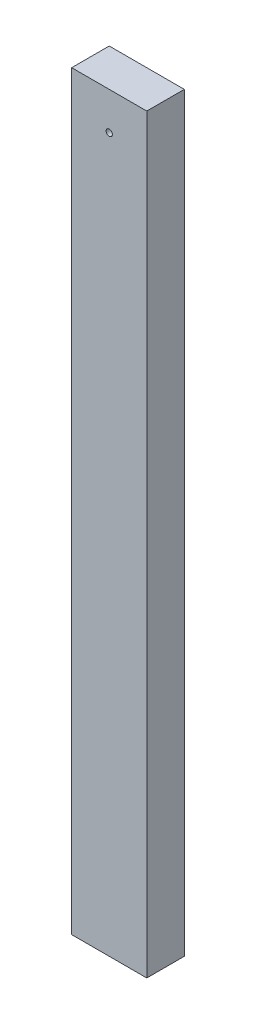
ISO-10303-21;
HEADER;
FILE_DESCRIPTION(('STEP AP214'),'2;1');
FILE_NAME('part.step','',(''),(''),'','','');
FILE_SCHEMA(('AUTOMOTIVE_DESIGN { 1 0 10303 214 1 1 1 1 }'));
ENDSEC;
DATA;
#1=APPLICATION_CONTEXT('core data for automotive mechanical design processes');
#2=APPLICATION_PROTOCOL_DEFINITION('international standard','automotive_design',2000,#1);
#3=PRODUCT_CONTEXT('',#1,'mechanical');
#4=PRODUCT('Part','Part','',(#3));
#5=PRODUCT_RELATED_PRODUCT_CATEGORY('part','',(#4));
#6=PRODUCT_DEFINITION_FORMATION('','',#4);
#7=PRODUCT_DEFINITION_CONTEXT('part definition',#1,'design');
#8=PRODUCT_DEFINITION('design','',#6,#7);
#9=PRODUCT_DEFINITION_SHAPE('','',#8);
#10=(LENGTH_UNIT() NAMED_UNIT(*) SI_UNIT(.MILLI.,.METRE.));
#11=(NAMED_UNIT(*) PLANE_ANGLE_UNIT() SI_UNIT($,.RADIAN.));
#12=(NAMED_UNIT(*) SI_UNIT($,.STERADIAN.) SOLID_ANGLE_UNIT());
#13=UNCERTAINTY_MEASURE_WITH_UNIT(LENGTH_MEASURE(1.E-05),#10,'distance_accuracy_value','');
#14=(GEOMETRIC_REPRESENTATION_CONTEXT(3) GLOBAL_UNCERTAINTY_ASSIGNED_CONTEXT((#13)) GLOBAL_UNIT_ASSIGNED_CONTEXT((#10,
#11,#12)) REPRESENTATION_CONTEXT('',''));
#15=CARTESIAN_POINT('',(0.,0.,0.));
#16=DIRECTION('',(0.,0.,1.));
#17=DIRECTION('',(1.,0.,0.));
#18=AXIS2_PLACEMENT_3D('',#15,#16,#17);
#19=CARTESIAN_POINT('',(76.2,1524.,38.1));
#20=DIRECTION('',(-1.,0.,0.));
#21=DIRECTION('',(0.,0.,1.));
#22=AXIS2_PLACEMENT_3D('',#19,#20,#21);
#23=PLANE('',#22);
#24=DIRECTION('',(0.,0.,-1.));
#25=VECTOR('',#24,1.);
#26=CARTESIAN_POINT('',(76.2,0.,38.1));
#27=LINE('',#26,#25);
#28=CARTESIAN_POINT('',(76.2,0.,38.1));
#29=VERTEX_POINT('',#28);
#30=CARTESIAN_POINT('',(76.2,0.,-38.1));
#31=VERTEX_POINT('',#30);
#32=EDGE_CURVE('E95',#29,#31,#27,.T.);
#33=ORIENTED_EDGE('',*,*,#32,.T.);
#34=DIRECTION('',(0.,-1.,0.));
#35=VECTOR('',#34,1.);
#36=CARTESIAN_POINT('',(76.2,1524.,-38.1));
#37=LINE('',#36,#35);
#38=CARTESIAN_POINT('',(76.2,1524.,-38.1));
#39=VERTEX_POINT('',#38);
#40=EDGE_CURVE('E11',#39,#31,#37,.T.);
#41=ORIENTED_EDGE('',*,*,#40,.F.);
#42=DIRECTION('',(0.,0.,-1.));
#43=VECTOR('',#42,1.);
#44=CARTESIAN_POINT('',(76.2,1524.,38.1));
#45=LINE('',#44,#43);
#46=CARTESIAN_POINT('',(76.2,1524.,38.1));
#47=VERTEX_POINT('',#46);
#48=EDGE_CURVE('E83',#47,#39,#45,.T.);
#49=ORIENTED_EDGE('',*,*,#48,.F.);
#50=DIRECTION('',(0.,-1.,0.));
#51=VECTOR('',#50,1.);
#52=CARTESIAN_POINT('',(76.2,1524.,38.1));
#53=LINE('',#52,#51);
#54=EDGE_CURVE('E91',#47,#29,#53,.T.);
#55=ORIENTED_EDGE('',*,*,#54,.T.);
#56=EDGE_LOOP('',(#33,#41,#49,#55));
#57=FACE_BOUND('',#56,.T.);
#58=ADVANCED_FACE('F32',(#57),#23,.F.);
#59=CARTESIAN_POINT('',(-76.2,1524.,-38.1));
#60=DIRECTION('',(0.,0.,1.));
#61=DIRECTION('',(1.,0.,0.));
#62=AXIS2_PLACEMENT_3D('',#59,#60,#61);
#63=PLANE('',#62);
#64=CARTESIAN_POINT('',(0.,1447.8,-38.1));
#65=DIRECTION('',(0.,0.,1.));
#66=DIRECTION('',(1.,0.,0.));
#67=AXIS2_PLACEMENT_3D('',#64,#65,#66);
#68=CIRCLE('',#67,6.35);
#69=CARTESIAN_POINT('',(6.35,1447.8,-38.1));
#70=VERTEX_POINT('',#69);
#71=EDGE_CURVE('E98',#70,#70,#68,.F.);
#72=ORIENTED_EDGE('',*,*,#71,.F.);
#73=EDGE_LOOP('',(#72));
#74=FACE_BOUND('',#73,.T.);
#75=DIRECTION('',(-1.,0.,0.));
#76=VECTOR('',#75,1.);
#77=CARTESIAN_POINT('',(-76.2,0.,-38.1));
#78=LINE('',#77,#76);
#79=CARTESIAN_POINT('',(-76.2,0.,-38.1));
#80=VERTEX_POINT('',#79);
#81=EDGE_CURVE('E87',#31,#80,#78,.T.);
#82=ORIENTED_EDGE('',*,*,#81,.T.);
#83=DIRECTION('',(0.,-1.,0.));
#84=VECTOR('',#83,1.);
#85=CARTESIAN_POINT('',(-76.2,1524.,-38.1));
#86=LINE('',#85,#84);
#87=CARTESIAN_POINT('',(-76.2,1524.,-38.1));
#88=VERTEX_POINT('',#87);
#89=EDGE_CURVE('E40',#88,#80,#86,.T.);
#90=ORIENTED_EDGE('',*,*,#89,.F.);
#91=DIRECTION('',(-1.,0.,0.));
#92=VECTOR('',#91,1.);
#93=CARTESIAN_POINT('',(-76.2,1524.,-38.1));
#94=LINE('',#93,#92);
#95=EDGE_CURVE('E78',#39,#88,#94,.T.);
#96=ORIENTED_EDGE('',*,*,#95,.F.);
#97=ORIENTED_EDGE('',*,*,#40,.T.);
#98=EDGE_LOOP('',(#82,#90,#96,#97));
#99=FACE_BOUND('',#98,.T.);
#100=ADVANCED_FACE('F86',(#74,#99),#63,.F.);
#101=CARTESIAN_POINT('',(-76.2,1524.,38.1));
#102=DIRECTION('',(1.,0.,0.));
#103=DIRECTION('',(0.,0.,-1.));
#104=AXIS2_PLACEMENT_3D('',#101,#102,#103);
#105=PLANE('',#104);
#106=DIRECTION('',(0.,0.,1.));
#107=VECTOR('',#106,1.);
#108=CARTESIAN_POINT('',(-76.2,0.,38.1));
#109=LINE('',#108,#107);
#110=CARTESIAN_POINT('',(-76.2,0.,38.1));
#111=VERTEX_POINT('',#110);
#112=EDGE_CURVE('E65',#80,#111,#109,.T.);
#113=ORIENTED_EDGE('',*,*,#112,.T.);
#114=DIRECTION('',(0.,-1.,0.));
#115=VECTOR('',#114,1.);
#116=CARTESIAN_POINT('',(-76.2,1524.,38.1));
#117=LINE('',#116,#115);
#118=CARTESIAN_POINT('',(-76.2,1524.,38.1));
#119=VERTEX_POINT('',#118);
#120=EDGE_CURVE('E88',#119,#111,#117,.T.);
#121=ORIENTED_EDGE('',*,*,#120,.F.);
#122=DIRECTION('',(0.,0.,1.));
#123=VECTOR('',#122,1.);
#124=CARTESIAN_POINT('',(-76.2,1524.,38.1));
#125=LINE('',#124,#123);
#126=EDGE_CURVE('E81',#88,#119,#125,.T.);
#127=ORIENTED_EDGE('',*,*,#126,.F.);
#128=ORIENTED_EDGE('',*,*,#89,.T.);
#129=EDGE_LOOP('',(#113,#121,#127,#128));
#130=FACE_BOUND('',#129,.T.);
#131=ADVANCED_FACE('F89',(#130),#105,.F.);
#132=CARTESIAN_POINT('',(-76.2,1524.,38.1));
#133=DIRECTION('',(0.,0.,-1.));
#134=DIRECTION('',(-1.,0.,0.));
#135=AXIS2_PLACEMENT_3D('',#132,#133,#134);
#136=PLANE('',#135);
#137=CARTESIAN_POINT('',(0.,1447.8,38.1));
#138=DIRECTION('',(0.,0.,1.));
#139=DIRECTION('',(1.,0.,0.));
#140=AXIS2_PLACEMENT_3D('',#137,#138,#139);
#141=CIRCLE('',#140,6.35);
#142=CARTESIAN_POINT('',(6.35,1447.8,38.1));
#143=VERTEX_POINT('',#142);
#144=EDGE_CURVE('E111',#143,#143,#141,.T.);
#145=ORIENTED_EDGE('',*,*,#144,.F.);
#146=EDGE_LOOP('',(#145));
#147=FACE_BOUND('',#146,.T.);
#148=DIRECTION('',(1.,0.,0.));
#149=VECTOR('',#148,1.);
#150=CARTESIAN_POINT('',(-76.2,0.,38.1));
#151=LINE('',#150,#149);
#152=EDGE_CURVE('E71',#111,#29,#151,.T.);
#153=ORIENTED_EDGE('',*,*,#152,.T.);
#154=ORIENTED_EDGE('',*,*,#54,.F.);
#155=DIRECTION('',(1.,0.,0.));
#156=VECTOR('',#155,1.);
#157=CARTESIAN_POINT('',(-76.2,1524.,38.1));
#158=LINE('',#157,#156);
#159=EDGE_CURVE('E48',#119,#47,#158,.T.);
#160=ORIENTED_EDGE('',*,*,#159,.F.);
#161=ORIENTED_EDGE('',*,*,#120,.T.);
#162=EDGE_LOOP('',(#153,#154,#160,#161));
#163=FACE_BOUND('',#162,.T.);
#164=ADVANCED_FACE('F103',(#147,#163),#136,.F.);
#165=CARTESIAN_POINT('',(0.,1524.,0.));
#166=DIRECTION('',(0.,-1.,0.));
#167=DIRECTION('',(0.,0.,-1.));
#168=AXIS2_PLACEMENT_3D('',#165,#166,#167);
#169=PLANE('',#168);
#170=ORIENTED_EDGE('',*,*,#48,.T.);
#171=ORIENTED_EDGE('',*,*,#95,.T.);
#172=ORIENTED_EDGE('',*,*,#126,.T.);
#173=ORIENTED_EDGE('',*,*,#159,.T.);
#174=EDGE_LOOP('',(#170,#171,#172,#173));
#175=FACE_BOUND('',#174,.T.);
#176=ADVANCED_FACE('F79',(#175),#169,.F.);
#177=CARTESIAN_POINT('',(0.,0.,0.));
#178=DIRECTION('',(0.,-1.,0.));
#179=DIRECTION('',(0.,0.,-1.));
#180=AXIS2_PLACEMENT_3D('',#177,#178,#179);
#181=PLANE('',#180);
#182=ORIENTED_EDGE('',*,*,#32,.F.);
#183=ORIENTED_EDGE('',*,*,#152,.F.);
#184=ORIENTED_EDGE('',*,*,#112,.F.);
#185=ORIENTED_EDGE('',*,*,#81,.F.);
#186=EDGE_LOOP('',(#182,#183,#184,#185));
#187=FACE_BOUND('',#186,.T.);
#188=ADVANCED_FACE('F106',(#187),#181,.T.);
#189=CARTESIAN_POINT('',(0.,1447.8,-38.101));
#190=DIRECTION('',(0.,0.,1.));
#191=DIRECTION('',(1.,0.,0.));
#192=AXIS2_PLACEMENT_3D('',#189,#190,#191);
#193=CYLINDRICAL_SURFACE('',#192,6.35);
#194=ORIENTED_EDGE('',*,*,#144,.T.);
#195=EDGE_LOOP('',(#194));
#196=FACE_BOUND('',#195,.T.);
#197=ORIENTED_EDGE('',*,*,#71,.T.);
#198=EDGE_LOOP('',(#197));
#199=FACE_BOUND('',#198,.T.);
#200=ADVANCED_FACE('F115',(#196,#199),#193,.F.);
#201=CLOSED_SHELL('',(#58,#100,#131,#164,#176,#188,#200));
#202=MANIFOLD_SOLID_BREP('B2',#201);
#203=ADVANCED_BREP_SHAPE_REPRESENTATION('',(#18,#202),#14);
#204=SHAPE_DEFINITION_REPRESENTATION(#9,#203);
ENDSEC;
END-ISO-10303-21;
